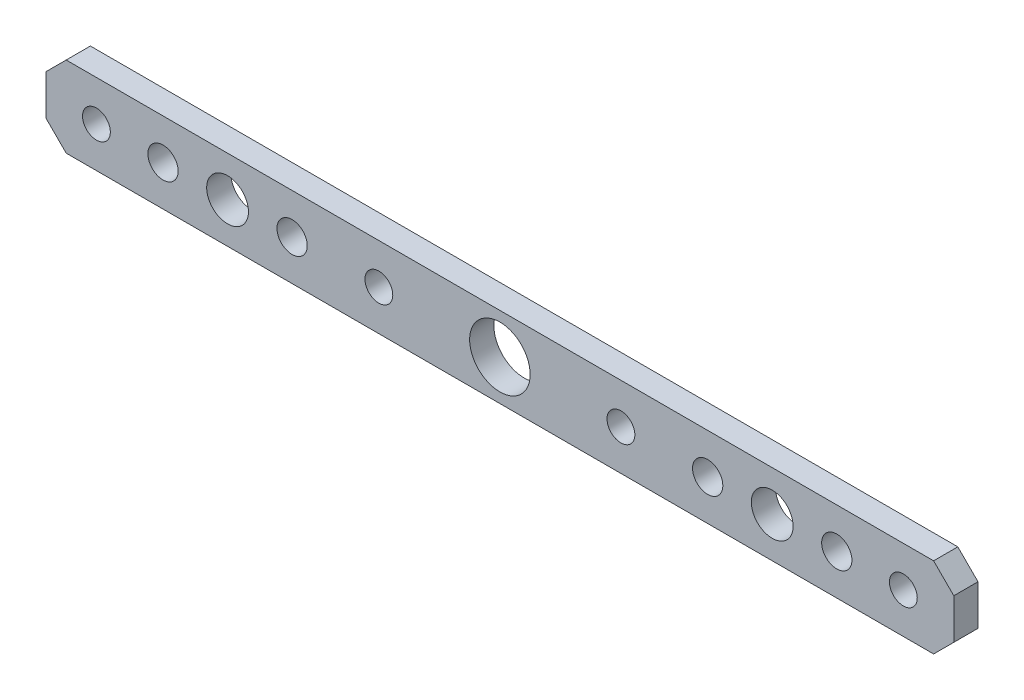
ISO-10303-21;
HEADER;
FILE_DESCRIPTION(('STEP AP214'),'2;1');
FILE_NAME('part.step','',(''),(''),'','','');
FILE_SCHEMA(('AUTOMOTIVE_DESIGN { 1 0 10303 214 1 1 1 1 }'));
ENDSEC;
DATA;
#1=APPLICATION_CONTEXT('core data for automotive mechanical design processes');
#2=APPLICATION_PROTOCOL_DEFINITION('international standard','automotive_design',2000,#1);
#3=PRODUCT_CONTEXT('',#1,'mechanical');
#4=PRODUCT('Part','Part','',(#3));
#5=PRODUCT_RELATED_PRODUCT_CATEGORY('part','',(#4));
#6=PRODUCT_DEFINITION_FORMATION('','',#4);
#7=PRODUCT_DEFINITION_CONTEXT('part definition',#1,'design');
#8=PRODUCT_DEFINITION('design','',#6,#7);
#9=PRODUCT_DEFINITION_SHAPE('','',#8);
#10=(LENGTH_UNIT() NAMED_UNIT(*) SI_UNIT(.MILLI.,.METRE.));
#11=(NAMED_UNIT(*) PLANE_ANGLE_UNIT() SI_UNIT($,.RADIAN.));
#12=(NAMED_UNIT(*) SI_UNIT($,.STERADIAN.) SOLID_ANGLE_UNIT());
#13=UNCERTAINTY_MEASURE_WITH_UNIT(LENGTH_MEASURE(1.E-05),#10,'distance_accuracy_value','');
#14=(GEOMETRIC_REPRESENTATION_CONTEXT(3) GLOBAL_UNCERTAINTY_ASSIGNED_CONTEXT((#13)) GLOBAL_UNIT_ASSIGNED_CONTEXT((#10,
#11,#12)) REPRESENTATION_CONTEXT('',''));
#15=CARTESIAN_POINT('',(0.,0.,0.));
#16=DIRECTION('',(0.,0.,1.));
#17=DIRECTION('',(1.,0.,0.));
#18=AXIS2_PLACEMENT_3D('',#15,#16,#17);
#19=CARTESIAN_POINT('',(0.,0.,6.));
#20=DIRECTION('',(0.,0.,1.));
#21=DIRECTION('',(1.,0.,0.));
#22=AXIS2_PLACEMENT_3D('',#19,#20,#21);
#23=PLANE('',#22);
#24=CARTESIAN_POINT('',(-99.4827668172094,-19.612075112907,6.));
#25=DIRECTION('',(0.,0.,1.));
#26=DIRECTION('',(1.,0.,0.));
#27=AXIS2_PLACEMENT_3D('',#24,#25,#26);
#28=CIRCLE('',#27,3.44580043072532);
#29=CARTESIAN_POINT('',(-96.0369663864841,-19.612075112907,6.));
#30=VERTEX_POINT('',#29);
#31=EDGE_CURVE('E224',#30,#30,#28,.T.);
#32=ORIENTED_EDGE('',*,*,#31,.F.);
#33=EDGE_LOOP('',(#32));
#34=FACE_BOUND('',#33,.T.);
#35=CARTESIAN_POINT('',(-29.4827668172094,-19.612075112907,6.));
#36=DIRECTION('',(0.,0.,1.));
#37=DIRECTION('',(1.,0.,0.));
#38=AXIS2_PLACEMENT_3D('',#35,#36,#37);
#39=CIRCLE('',#38,3.44580043072532);
#40=CARTESIAN_POINT('',(-26.036966386484,-19.612075112907,6.));
#41=VERTEX_POINT('',#40);
#42=EDGE_CURVE('E212',#41,#41,#39,.T.);
#43=ORIENTED_EDGE('',*,*,#42,.F.);
#44=EDGE_LOOP('',(#43));
#45=FACE_BOUND('',#44,.T.);
#46=CARTESIAN_POINT('',(-66.9827668172094,-19.612075112907,6.));
#47=DIRECTION('',(0.,0.,1.));
#48=DIRECTION('',(1.,0.,0.));
#49=AXIS2_PLACEMENT_3D('',#46,#47,#48);
#50=CIRCLE('',#49,5.17499999999999);
#51=CARTESIAN_POINT('',(-61.8077668172094,-19.612075112907,6.));
#52=VERTEX_POINT('',#51);
#53=EDGE_CURVE('E200',#52,#52,#50,.T.);
#54=ORIENTED_EDGE('',*,*,#53,.F.);
#55=EDGE_LOOP('',(#54));
#56=FACE_BOUND('',#55,.T.);
#57=CARTESIAN_POINT('',(-50.9827668172094,-19.612075112907,6.));
#58=DIRECTION('',(0.,0.,1.));
#59=DIRECTION('',(1.,0.,0.));
#60=AXIS2_PLACEMENT_3D('',#57,#58,#59);
#61=CIRCLE('',#60,3.75000000000001);
#62=CARTESIAN_POINT('',(-47.2327668172094,-19.612075112907,6.));
#63=VERTEX_POINT('',#62);
#64=EDGE_CURVE('E188',#63,#63,#61,.T.);
#65=ORIENTED_EDGE('',*,*,#64,.F.);
#66=EDGE_LOOP('',(#65));
#67=FACE_BOUND('',#66,.T.);
#68=CARTESIAN_POINT('',(52.0172331827906,-19.612075112907,6.));
#69=DIRECTION('',(0.,0.,1.));
#70=DIRECTION('',(1.,0.,0.));
#71=AXIS2_PLACEMENT_3D('',#68,#69,#70);
#72=CIRCLE('',#71,3.75000000000001);
#73=CARTESIAN_POINT('',(55.7672331827906,-19.612075112907,6.));
#74=VERTEX_POINT('',#73);
#75=EDGE_CURVE('E177',#74,#74,#72,.T.);
#76=ORIENTED_EDGE('',*,*,#75,.F.);
#77=EDGE_LOOP('',(#76));
#78=FACE_BOUND('',#77,.T.);
#79=DIRECTION('',(1.,0.,0.));
#80=VECTOR('',#79,1.);
#81=CARTESIAN_POINT('',(-111.982766817209,-29.612075112907,6.));
#82=LINE('',#81,#80);
#83=CARTESIAN_POINT('',(-106.982766817209,-29.612075112907,6.));
#84=VERTEX_POINT('',#83);
#85=CARTESIAN_POINT('',(108.017233182791,-29.612075112907,6.));
#86=VERTEX_POINT('',#85);
#87=EDGE_CURVE('E172',#84,#86,#82,.T.);
#88=ORIENTED_EDGE('',*,*,#87,.T.);
#89=DIRECTION('',(-0.707106781186549,-0.707106781186546,0.));
#90=VECTOR('',#89,1.);
#91=CARTESIAN_POINT('',(68.8146541478485,-68.8146541478489,6.));
#92=LINE('',#91,#90);
#93=CARTESIAN_POINT('',(113.017233182791,-24.6120751129071,6.));
#94=VERTEX_POINT('',#93);
#95=EDGE_CURVE('E149',#86,#94,#92,.F.);
#96=ORIENTED_EDGE('',*,*,#95,.T.);
#97=DIRECTION('',(0.,1.,0.));
#98=VECTOR('',#97,1.);
#99=CARTESIAN_POINT('',(113.017233182791,-29.612075112907,6.));
#100=LINE('',#99,#98);
#101=CARTESIAN_POINT('',(113.017233182791,-14.612075112907,6.));
#102=VERTEX_POINT('',#101);
#103=EDGE_CURVE('E119',#94,#102,#100,.T.);
#104=ORIENTED_EDGE('',*,*,#103,.T.);
#105=DIRECTION('',(0.707106781186548,-0.707106781186548,0.));
#106=VECTOR('',#105,1.);
#107=CARTESIAN_POINT('',(49.2025790349418,49.2025790349418,6.));
#108=LINE('',#107,#106);
#109=CARTESIAN_POINT('',(108.017233182791,-9.61207511290702,6.));
#110=VERTEX_POINT('',#109);
#111=EDGE_CURVE('E56',#102,#110,#108,.F.);
#112=ORIENTED_EDGE('',*,*,#111,.T.);
#113=DIRECTION('',(-1.,0.,0.));
#114=VECTOR('',#113,1.);
#115=CARTESIAN_POINT('',(-111.982766817209,-9.61207511290705,6.));
#116=LINE('',#115,#114);
#117=CARTESIAN_POINT('',(-106.982766817209,-9.61207511290705,6.));
#118=VERTEX_POINT('',#117);
#119=EDGE_CURVE('E135',#110,#118,#116,.T.);
#120=ORIENTED_EDGE('',*,*,#119,.T.);
#121=DIRECTION('',(0.707106781186549,0.707106781186546,0.));
#122=VECTOR('',#121,1.);
#123=CARTESIAN_POINT('',(-48.6853458521509,48.6853458521511,6.));
#124=LINE('',#123,#122);
#125=CARTESIAN_POINT('',(-111.982766817209,-14.612075112907,6.));
#126=VERTEX_POINT('',#125);
#127=EDGE_CURVE('E144',#118,#126,#124,.F.);
#128=ORIENTED_EDGE('',*,*,#127,.T.);
#129=DIRECTION('',(0.,-1.,0.));
#130=VECTOR('',#129,1.);
#131=CARTESIAN_POINT('',(-111.982766817209,-9.61207511290705,6.));
#132=LINE('',#131,#130);
#133=CARTESIAN_POINT('',(-111.982766817209,-24.6120751129071,6.));
#134=VERTEX_POINT('',#133);
#135=EDGE_CURVE('E129',#126,#134,#132,.T.);
#136=ORIENTED_EDGE('',*,*,#135,.T.);
#137=DIRECTION('',(-0.707106781186548,0.707106781186548,0.));
#138=VECTOR('',#137,1.);
#139=CARTESIAN_POINT('',(-68.2974209650582,-68.2974209650582,6.));
#140=LINE('',#139,#138);
#141=EDGE_CURVE('E146',#134,#84,#140,.F.);
#142=ORIENTED_EDGE('',*,*,#141,.T.);
#143=EDGE_LOOP('',(#88,#96,#104,#112,#120,#128,#136,#142));
#144=FACE_BOUND('',#143,.T.);
#145=CARTESIAN_POINT('',(84.0172331827906,-19.612075112907,6.));
#146=DIRECTION('',(0.,0.,1.));
#147=DIRECTION('',(1.,0.,0.));
#148=AXIS2_PLACEMENT_3D('',#145,#146,#147);
#149=CIRCLE('',#148,3.75000000000001);
#150=CARTESIAN_POINT('',(87.7672331827906,-19.612075112907,6.));
#151=VERTEX_POINT('',#150);
#152=EDGE_CURVE('E165',#151,#151,#149,.T.);
#153=ORIENTED_EDGE('',*,*,#152,.F.);
#154=EDGE_LOOP('',(#153));
#155=FACE_BOUND('',#154,.T.);
#156=CARTESIAN_POINT('',(68.0172331827906,-19.612075112907,6.));
#157=DIRECTION('',(0.,0.,1.));
#158=DIRECTION('',(1.,0.,0.));
#159=AXIS2_PLACEMENT_3D('',#156,#157,#158);
#160=CIRCLE('',#159,5.17731514716483);
#161=CARTESIAN_POINT('',(73.1945483299555,-19.612075112907,6.));
#162=VERTEX_POINT('',#161);
#163=EDGE_CURVE('E182',#162,#162,#160,.T.);
#164=ORIENTED_EDGE('',*,*,#163,.F.);
#165=EDGE_LOOP('',(#164));
#166=FACE_BOUND('',#165,.T.);
#167=CARTESIAN_POINT('',(-82.9827668172094,-19.612075112907,6.));
#168=DIRECTION('',(0.,0.,1.));
#169=DIRECTION('',(1.,0.,0.));
#170=AXIS2_PLACEMENT_3D('',#167,#168,#169);
#171=CIRCLE('',#170,3.75000000000001);
#172=CARTESIAN_POINT('',(-79.2327668172094,-19.612075112907,6.));
#173=VERTEX_POINT('',#172);
#174=EDGE_CURVE('E194',#173,#173,#171,.T.);
#175=ORIENTED_EDGE('',*,*,#174,.F.);
#176=EDGE_LOOP('',(#175));
#177=FACE_BOUND('',#176,.T.);
#178=CARTESIAN_POINT('',(30.5172331827906,-19.612075112907,6.));
#179=DIRECTION('',(0.,0.,1.));
#180=DIRECTION('',(1.,0.,0.));
#181=AXIS2_PLACEMENT_3D('',#178,#179,#180);
#182=CIRCLE('',#181,3.44580043072533);
#183=CARTESIAN_POINT('',(33.963033613516,-19.612075112907,6.));
#184=VERTEX_POINT('',#183);
#185=EDGE_CURVE('E206',#184,#184,#182,.T.);
#186=ORIENTED_EDGE('',*,*,#185,.F.);
#187=EDGE_LOOP('',(#186));
#188=FACE_BOUND('',#187,.T.);
#189=CARTESIAN_POINT('',(100.517233182791,-19.612075112907,6.));
#190=DIRECTION('',(0.,0.,1.));
#191=DIRECTION('',(1.,0.,0.));
#192=AXIS2_PLACEMENT_3D('',#189,#190,#191);
#193=CIRCLE('',#192,3.44580043072534);
#194=CARTESIAN_POINT('',(103.963033613516,-19.612075112907,6.));
#195=VERTEX_POINT('',#194);
#196=EDGE_CURVE('E218',#195,#195,#193,.T.);
#197=ORIENTED_EDGE('',*,*,#196,.F.);
#198=EDGE_LOOP('',(#197));
#199=FACE_BOUND('',#198,.T.);
#200=CARTESIAN_POINT('',(0.517233182790622,-19.612075112907,6.));
#201=DIRECTION('',(0.,0.,1.));
#202=DIRECTION('',(1.,0.,0.));
#203=AXIS2_PLACEMENT_3D('',#200,#201,#202);
#204=CIRCLE('',#203,7.5);
#205=CARTESIAN_POINT('',(8.01723318279062,-19.612075112907,6.));
#206=VERTEX_POINT('',#205);
#207=EDGE_CURVE('E230',#206,#206,#204,.T.);
#208=ORIENTED_EDGE('',*,*,#207,.F.);
#209=EDGE_LOOP('',(#208));
#210=FACE_BOUND('',#209,.T.);
#211=ADVANCED_FACE('F34',(#34,#45,#56,#67,#78,#144,#155,#166,#177,#188,#199,#210),#23,.T.);
#212=CARTESIAN_POINT('',(0.,0.,0.));
#213=DIRECTION('',(0.,0.,1.));
#214=DIRECTION('',(1.,0.,0.));
#215=AXIS2_PLACEMENT_3D('',#212,#213,#214);
#216=PLANE('',#215);
#217=DIRECTION('',(0.,1.,0.));
#218=VECTOR('',#217,1.);
#219=CARTESIAN_POINT('',(113.017233182791,-29.612075112907,0.));
#220=LINE('',#219,#218);
#221=CARTESIAN_POINT('',(113.017233182791,-24.6120751129071,0.));
#222=VERTEX_POINT('',#221);
#223=CARTESIAN_POINT('',(113.017233182791,-14.612075112907,0.));
#224=VERTEX_POINT('',#223);
#225=EDGE_CURVE('E117',#222,#224,#220,.T.);
#226=ORIENTED_EDGE('',*,*,#225,.F.);
#227=DIRECTION('',(0.707106781186549,0.707106781186546,0.));
#228=VECTOR('',#227,1.);
#229=CARTESIAN_POINT('',(113.017233182791,-24.6120751129071,0.));
#230=LINE('',#229,#228);
#231=CARTESIAN_POINT('',(108.017233182791,-29.612075112907,0.));
#232=VERTEX_POINT('',#231);
#233=EDGE_CURVE('E100',#222,#232,#230,.F.);
#234=ORIENTED_EDGE('',*,*,#233,.T.);
#235=DIRECTION('',(1.,0.,0.));
#236=VECTOR('',#235,1.);
#237=CARTESIAN_POINT('',(-111.982766817209,-29.612075112907,0.));
#238=LINE('',#237,#236);
#239=CARTESIAN_POINT('',(-106.982766817209,-29.612075112907,0.));
#240=VERTEX_POINT('',#239);
#241=EDGE_CURVE('E127',#240,#232,#238,.T.);
#242=ORIENTED_EDGE('',*,*,#241,.F.);
#243=DIRECTION('',(0.707106781186548,-0.707106781186548,0.));
#244=VECTOR('',#243,1.);
#245=CARTESIAN_POINT('',(-106.982766817209,-29.612075112907,0.));
#246=LINE('',#245,#244);
#247=CARTESIAN_POINT('',(-111.982766817209,-24.6120751129071,0.));
#248=VERTEX_POINT('',#247);
#249=EDGE_CURVE('E138',#240,#248,#246,.F.);
#250=ORIENTED_EDGE('',*,*,#249,.T.);
#251=DIRECTION('',(0.,-1.,0.));
#252=VECTOR('',#251,1.);
#253=CARTESIAN_POINT('',(-111.982766817209,-9.61207511290705,0.));
#254=LINE('',#253,#252);
#255=CARTESIAN_POINT('',(-111.982766817209,-14.612075112907,0.));
#256=VERTEX_POINT('',#255);
#257=EDGE_CURVE('E131',#256,#248,#254,.T.);
#258=ORIENTED_EDGE('',*,*,#257,.F.);
#259=DIRECTION('',(-0.707106781186549,-0.707106781186546,0.));
#260=VECTOR('',#259,1.);
#261=CARTESIAN_POINT('',(-111.982766817209,-14.612075112907,0.));
#262=LINE('',#261,#260);
#263=CARTESIAN_POINT('',(-106.982766817209,-9.61207511290705,0.));
#264=VERTEX_POINT('',#263);
#265=EDGE_CURVE('E120',#256,#264,#262,.F.);
#266=ORIENTED_EDGE('',*,*,#265,.T.);
#267=DIRECTION('',(-1.,0.,0.));
#268=VECTOR('',#267,1.);
#269=CARTESIAN_POINT('',(-111.982766817209,-9.61207511290705,0.));
#270=LINE('',#269,#268);
#271=CARTESIAN_POINT('',(108.017233182791,-9.61207511290702,0.));
#272=VERTEX_POINT('',#271);
#273=EDGE_CURVE('E126',#272,#264,#270,.T.);
#274=ORIENTED_EDGE('',*,*,#273,.F.);
#275=DIRECTION('',(-0.707106781186548,0.707106781186548,0.));
#276=VECTOR('',#275,1.);
#277=CARTESIAN_POINT('',(108.017233182791,-9.61207511290702,0.));
#278=LINE('',#277,#276);
#279=EDGE_CURVE('E111',#272,#224,#278,.F.);
#280=ORIENTED_EDGE('',*,*,#279,.T.);
#281=EDGE_LOOP('',(#226,#234,#242,#250,#258,#266,#274,#280));
#282=FACE_BOUND('',#281,.T.);
#283=CARTESIAN_POINT('',(84.0172331827906,-19.612075112907,0.));
#284=DIRECTION('',(0.,0.,1.));
#285=DIRECTION('',(1.,0.,0.));
#286=AXIS2_PLACEMENT_3D('',#283,#284,#285);
#287=CIRCLE('',#286,3.75000000000001);
#288=CARTESIAN_POINT('',(87.7672331827906,-19.612075112907,0.));
#289=VERTEX_POINT('',#288);
#290=EDGE_CURVE('E167',#289,#289,#287,.T.);
#291=ORIENTED_EDGE('',*,*,#290,.T.);
#292=EDGE_LOOP('',(#291));
#293=FACE_BOUND('',#292,.T.);
#294=CARTESIAN_POINT('',(52.0172331827906,-19.612075112907,0.));
#295=DIRECTION('',(0.,0.,1.));
#296=DIRECTION('',(1.,0.,0.));
#297=AXIS2_PLACEMENT_3D('',#294,#295,#296);
#298=CIRCLE('',#297,3.75000000000001);
#299=CARTESIAN_POINT('',(55.7672331827906,-19.612075112907,0.));
#300=VERTEX_POINT('',#299);
#301=EDGE_CURVE('E179',#300,#300,#298,.T.);
#302=ORIENTED_EDGE('',*,*,#301,.T.);
#303=EDGE_LOOP('',(#302));
#304=FACE_BOUND('',#303,.T.);
#305=CARTESIAN_POINT('',(68.0172331827906,-19.612075112907,0.));
#306=DIRECTION('',(0.,0.,1.));
#307=DIRECTION('',(1.,0.,0.));
#308=AXIS2_PLACEMENT_3D('',#305,#306,#307);
#309=CIRCLE('',#308,5.17731514716483);
#310=CARTESIAN_POINT('',(73.1945483299555,-19.612075112907,0.));
#311=VERTEX_POINT('',#310);
#312=EDGE_CURVE('E185',#311,#311,#309,.T.);
#313=ORIENTED_EDGE('',*,*,#312,.T.);
#314=EDGE_LOOP('',(#313));
#315=FACE_BOUND('',#314,.T.);
#316=CARTESIAN_POINT('',(-50.9827668172094,-19.612075112907,0.));
#317=DIRECTION('',(0.,0.,1.));
#318=DIRECTION('',(1.,0.,0.));
#319=AXIS2_PLACEMENT_3D('',#316,#317,#318);
#320=CIRCLE('',#319,3.75000000000001);
#321=CARTESIAN_POINT('',(-47.2327668172094,-19.612075112907,0.));
#322=VERTEX_POINT('',#321);
#323=EDGE_CURVE('E191',#322,#322,#320,.T.);
#324=ORIENTED_EDGE('',*,*,#323,.T.);
#325=EDGE_LOOP('',(#324));
#326=FACE_BOUND('',#325,.T.);
#327=CARTESIAN_POINT('',(-82.9827668172094,-19.612075112907,0.));
#328=DIRECTION('',(0.,0.,1.));
#329=DIRECTION('',(1.,0.,0.));
#330=AXIS2_PLACEMENT_3D('',#327,#328,#329);
#331=CIRCLE('',#330,3.75000000000001);
#332=CARTESIAN_POINT('',(-79.2327668172094,-19.612075112907,0.));
#333=VERTEX_POINT('',#332);
#334=EDGE_CURVE('E197',#333,#333,#331,.T.);
#335=ORIENTED_EDGE('',*,*,#334,.T.);
#336=EDGE_LOOP('',(#335));
#337=FACE_BOUND('',#336,.T.);
#338=CARTESIAN_POINT('',(-66.9827668172094,-19.612075112907,0.));
#339=DIRECTION('',(0.,0.,1.));
#340=DIRECTION('',(1.,0.,0.));
#341=AXIS2_PLACEMENT_3D('',#338,#339,#340);
#342=CIRCLE('',#341,5.17499999999999);
#343=CARTESIAN_POINT('',(-61.8077668172094,-19.612075112907,0.));
#344=VERTEX_POINT('',#343);
#345=EDGE_CURVE('E203',#344,#344,#342,.T.);
#346=ORIENTED_EDGE('',*,*,#345,.T.);
#347=EDGE_LOOP('',(#346));
#348=FACE_BOUND('',#347,.T.);
#349=CARTESIAN_POINT('',(30.5172331827906,-19.612075112907,0.));
#350=DIRECTION('',(0.,0.,1.));
#351=DIRECTION('',(1.,0.,0.));
#352=AXIS2_PLACEMENT_3D('',#349,#350,#351);
#353=CIRCLE('',#352,3.44580043072533);
#354=CARTESIAN_POINT('',(33.963033613516,-19.612075112907,0.));
#355=VERTEX_POINT('',#354);
#356=EDGE_CURVE('E209',#355,#355,#353,.T.);
#357=ORIENTED_EDGE('',*,*,#356,.T.);
#358=EDGE_LOOP('',(#357));
#359=FACE_BOUND('',#358,.T.);
#360=CARTESIAN_POINT('',(-29.4827668172094,-19.612075112907,0.));
#361=DIRECTION('',(0.,0.,1.));
#362=DIRECTION('',(1.,0.,0.));
#363=AXIS2_PLACEMENT_3D('',#360,#361,#362);
#364=CIRCLE('',#363,3.44580043072532);
#365=CARTESIAN_POINT('',(-26.036966386484,-19.612075112907,0.));
#366=VERTEX_POINT('',#365);
#367=EDGE_CURVE('E215',#366,#366,#364,.T.);
#368=ORIENTED_EDGE('',*,*,#367,.T.);
#369=EDGE_LOOP('',(#368));
#370=FACE_BOUND('',#369,.T.);
#371=CARTESIAN_POINT('',(100.517233182791,-19.612075112907,0.));
#372=DIRECTION('',(0.,0.,1.));
#373=DIRECTION('',(1.,0.,0.));
#374=AXIS2_PLACEMENT_3D('',#371,#372,#373);
#375=CIRCLE('',#374,3.44580043072534);
#376=CARTESIAN_POINT('',(103.963033613516,-19.612075112907,0.));
#377=VERTEX_POINT('',#376);
#378=EDGE_CURVE('E221',#377,#377,#375,.T.);
#379=ORIENTED_EDGE('',*,*,#378,.T.);
#380=EDGE_LOOP('',(#379));
#381=FACE_BOUND('',#380,.T.);
#382=CARTESIAN_POINT('',(-99.4827668172094,-19.612075112907,0.));
#383=DIRECTION('',(0.,0.,1.));
#384=DIRECTION('',(1.,0.,0.));
#385=AXIS2_PLACEMENT_3D('',#382,#383,#384);
#386=CIRCLE('',#385,3.44580043072532);
#387=CARTESIAN_POINT('',(-96.0369663864841,-19.612075112907,0.));
#388=VERTEX_POINT('',#387);
#389=EDGE_CURVE('E227',#388,#388,#386,.T.);
#390=ORIENTED_EDGE('',*,*,#389,.T.);
#391=EDGE_LOOP('',(#390));
#392=FACE_BOUND('',#391,.T.);
#393=CARTESIAN_POINT('',(0.517233182790622,-19.612075112907,0.));
#394=DIRECTION('',(0.,0.,1.));
#395=DIRECTION('',(1.,0.,0.));
#396=AXIS2_PLACEMENT_3D('',#393,#394,#395);
#397=CIRCLE('',#396,7.5);
#398=CARTESIAN_POINT('',(8.01723318279062,-19.612075112907,0.));
#399=VERTEX_POINT('',#398);
#400=EDGE_CURVE('E233',#399,#399,#397,.T.);
#401=ORIENTED_EDGE('',*,*,#400,.T.);
#402=EDGE_LOOP('',(#401));
#403=FACE_BOUND('',#402,.T.);
#404=ADVANCED_FACE('F123',(#282,#293,#304,#315,#326,#337,#348,#359,#370,#381,#392,#403),#216,.F.);
#405=CARTESIAN_POINT('',(-111.982766817209,-9.61207511290705,6.));
#406=DIRECTION('',(1.,0.,0.));
#407=DIRECTION('',(0.,0.,-1.));
#408=AXIS2_PLACEMENT_3D('',#405,#406,#407);
#409=PLANE('',#408);
#410=ORIENTED_EDGE('',*,*,#257,.T.);
#411=DIRECTION('',(0.,0.,1.));
#412=VECTOR('',#411,1.);
#413=CARTESIAN_POINT('',(-111.982766817209,-24.6120751129071,6.));
#414=LINE('',#413,#412);
#415=EDGE_CURVE('E11',#248,#134,#414,.T.);
#416=ORIENTED_EDGE('',*,*,#415,.T.);
#417=ORIENTED_EDGE('',*,*,#135,.F.);
#418=DIRECTION('',(0.,0.,-1.));
#419=VECTOR('',#418,1.);
#420=CARTESIAN_POINT('',(-111.982766817209,-14.612075112907,6.));
#421=LINE('',#420,#419);
#422=EDGE_CURVE('E42',#126,#256,#421,.T.);
#423=ORIENTED_EDGE('',*,*,#422,.T.);
#424=EDGE_LOOP('',(#410,#416,#417,#423));
#425=FACE_BOUND('',#424,.T.);
#426=ADVANCED_FACE('F160',(#425),#409,.F.);
#427=CARTESIAN_POINT('',(-111.982766817209,-29.612075112907,6.));
#428=DIRECTION('',(0.,1.,0.));
#429=DIRECTION('',(0.,0.,1.));
#430=AXIS2_PLACEMENT_3D('',#427,#428,#429);
#431=PLANE('',#430);
#432=ORIENTED_EDGE('',*,*,#241,.T.);
#433=DIRECTION('',(0.,0.,1.));
#434=VECTOR('',#433,1.);
#435=CARTESIAN_POINT('',(108.017233182791,-29.612075112907,6.));
#436=LINE('',#435,#434);
#437=EDGE_CURVE('E105',#232,#86,#436,.T.);
#438=ORIENTED_EDGE('',*,*,#437,.T.);
#439=ORIENTED_EDGE('',*,*,#87,.F.);
#440=DIRECTION('',(0.,0.,-1.));
#441=VECTOR('',#440,1.);
#442=CARTESIAN_POINT('',(-106.982766817209,-29.612075112907,6.));
#443=LINE('',#442,#441);
#444=EDGE_CURVE('E110',#84,#240,#443,.T.);
#445=ORIENTED_EDGE('',*,*,#444,.T.);
#446=EDGE_LOOP('',(#432,#438,#439,#445));
#447=FACE_BOUND('',#446,.T.);
#448=ADVANCED_FACE('F260',(#447),#431,.F.);
#449=CARTESIAN_POINT('',(113.017233182791,-29.612075112907,6.));
#450=DIRECTION('',(-1.,0.,0.));
#451=DIRECTION('',(0.,0.,1.));
#452=AXIS2_PLACEMENT_3D('',#449,#450,#451);
#453=PLANE('',#452);
#454=ORIENTED_EDGE('',*,*,#103,.F.);
#455=DIRECTION('',(0.,0.,-1.));
#456=VECTOR('',#455,1.);
#457=CARTESIAN_POINT('',(113.017233182791,-24.6120751129071,6.));
#458=LINE('',#457,#456);
#459=EDGE_CURVE('E104',#94,#222,#458,.T.);
#460=ORIENTED_EDGE('',*,*,#459,.T.);
#461=ORIENTED_EDGE('',*,*,#225,.T.);
#462=DIRECTION('',(0.,0.,1.));
#463=VECTOR('',#462,1.);
#464=CARTESIAN_POINT('',(113.017233182791,-14.612075112907,6.));
#465=LINE('',#464,#463);
#466=EDGE_CURVE('E121',#224,#102,#465,.T.);
#467=ORIENTED_EDGE('',*,*,#466,.T.);
#468=EDGE_LOOP('',(#454,#460,#461,#467));
#469=FACE_BOUND('',#468,.T.);
#470=ADVANCED_FACE('F116',(#469),#453,.F.);
#471=CARTESIAN_POINT('',(-111.982766817209,-9.61207511290705,6.));
#472=DIRECTION('',(0.,-1.,0.));
#473=DIRECTION('',(1.,0.,0.));
#474=AXIS2_PLACEMENT_3D('',#471,#472,#473);
#475=PLANE('',#474);
#476=ORIENTED_EDGE('',*,*,#119,.F.);
#477=DIRECTION('',(0.,0.,-1.));
#478=VECTOR('',#477,1.);
#479=CARTESIAN_POINT('',(108.017233182791,-9.61207511290702,6.));
#480=LINE('',#479,#478);
#481=EDGE_CURVE('E152',#110,#272,#480,.T.);
#482=ORIENTED_EDGE('',*,*,#481,.T.);
#483=ORIENTED_EDGE('',*,*,#273,.T.);
#484=DIRECTION('',(0.,0.,1.));
#485=VECTOR('',#484,1.);
#486=CARTESIAN_POINT('',(-106.982766817209,-9.61207511290705,6.));
#487=LINE('',#486,#485);
#488=EDGE_CURVE('E49',#264,#118,#487,.T.);
#489=ORIENTED_EDGE('',*,*,#488,.T.);
#490=EDGE_LOOP('',(#476,#482,#483,#489));
#491=FACE_BOUND('',#490,.T.);
#492=ADVANCED_FACE('F255',(#491),#475,.F.);
#493=CARTESIAN_POINT('',(84.0172331827906,-19.612075112907,6.));
#494=DIRECTION('',(0.,0.,-1.));
#495=DIRECTION('',(-1.,0.,0.));
#496=AXIS2_PLACEMENT_3D('',#493,#494,#495);
#497=CYLINDRICAL_SURFACE('',#496,3.75000000000001);
#498=ORIENTED_EDGE('',*,*,#152,.T.);
#499=EDGE_LOOP('',(#498));
#500=FACE_BOUND('',#499,.T.);
#501=ORIENTED_EDGE('',*,*,#290,.F.);
#502=EDGE_LOOP('',(#501));
#503=FACE_BOUND('',#502,.T.);
#504=ADVANCED_FACE('F252',(#500,#503),#497,.F.);
#505=CARTESIAN_POINT('',(52.0172331827906,-19.612075112907,6.));
#506=DIRECTION('',(0.,0.,-1.));
#507=DIRECTION('',(-1.,0.,0.));
#508=AXIS2_PLACEMENT_3D('',#505,#506,#507);
#509=CYLINDRICAL_SURFACE('',#508,3.75000000000001);
#510=ORIENTED_EDGE('',*,*,#75,.T.);
#511=EDGE_LOOP('',(#510));
#512=FACE_BOUND('',#511,.T.);
#513=ORIENTED_EDGE('',*,*,#301,.F.);
#514=EDGE_LOOP('',(#513));
#515=FACE_BOUND('',#514,.T.);
#516=ADVANCED_FACE('F333',(#512,#515),#509,.F.);
#517=CARTESIAN_POINT('',(68.0172331827906,-19.612075112907,6.));
#518=DIRECTION('',(0.,0.,-1.));
#519=DIRECTION('',(-1.,0.,0.));
#520=AXIS2_PLACEMENT_3D('',#517,#518,#519);
#521=CYLINDRICAL_SURFACE('',#520,5.17731514716483);
#522=ORIENTED_EDGE('',*,*,#163,.T.);
#523=EDGE_LOOP('',(#522));
#524=FACE_BOUND('',#523,.T.);
#525=ORIENTED_EDGE('',*,*,#312,.F.);
#526=EDGE_LOOP('',(#525));
#527=FACE_BOUND('',#526,.T.);
#528=ADVANCED_FACE('F330',(#524,#527),#521,.F.);
#529=CARTESIAN_POINT('',(-50.9827668172094,-19.612075112907,6.));
#530=DIRECTION('',(0.,0.,-1.));
#531=DIRECTION('',(-1.,0.,0.));
#532=AXIS2_PLACEMENT_3D('',#529,#530,#531);
#533=CYLINDRICAL_SURFACE('',#532,3.75000000000001);
#534=ORIENTED_EDGE('',*,*,#64,.T.);
#535=EDGE_LOOP('',(#534));
#536=FACE_BOUND('',#535,.T.);
#537=ORIENTED_EDGE('',*,*,#323,.F.);
#538=EDGE_LOOP('',(#537));
#539=FACE_BOUND('',#538,.T.);
#540=ADVANCED_FACE('F326',(#536,#539),#533,.F.);
#541=CARTESIAN_POINT('',(-82.9827668172094,-19.612075112907,6.));
#542=DIRECTION('',(0.,0.,-1.));
#543=DIRECTION('',(-1.,0.,0.));
#544=AXIS2_PLACEMENT_3D('',#541,#542,#543);
#545=CYLINDRICAL_SURFACE('',#544,3.75000000000001);
#546=ORIENTED_EDGE('',*,*,#174,.T.);
#547=EDGE_LOOP('',(#546));
#548=FACE_BOUND('',#547,.T.);
#549=ORIENTED_EDGE('',*,*,#334,.F.);
#550=EDGE_LOOP('',(#549));
#551=FACE_BOUND('',#550,.T.);
#552=ADVANCED_FACE('F322',(#548,#551),#545,.F.);
#553=CARTESIAN_POINT('',(-66.9827668172094,-19.612075112907,6.));
#554=DIRECTION('',(0.,0.,-1.));
#555=DIRECTION('',(-1.,0.,0.));
#556=AXIS2_PLACEMENT_3D('',#553,#554,#555);
#557=CYLINDRICAL_SURFACE('',#556,5.17499999999999);
#558=ORIENTED_EDGE('',*,*,#53,.T.);
#559=EDGE_LOOP('',(#558));
#560=FACE_BOUND('',#559,.T.);
#561=ORIENTED_EDGE('',*,*,#345,.F.);
#562=EDGE_LOOP('',(#561));
#563=FACE_BOUND('',#562,.T.);
#564=ADVANCED_FACE('F318',(#560,#563),#557,.F.);
#565=CARTESIAN_POINT('',(30.5172331827906,-19.612075112907,6.));
#566=DIRECTION('',(0.,0.,-1.));
#567=DIRECTION('',(-1.,0.,0.));
#568=AXIS2_PLACEMENT_3D('',#565,#566,#567);
#569=CYLINDRICAL_SURFACE('',#568,3.44580043072533);
#570=ORIENTED_EDGE('',*,*,#185,.T.);
#571=EDGE_LOOP('',(#570));
#572=FACE_BOUND('',#571,.T.);
#573=ORIENTED_EDGE('',*,*,#356,.F.);
#574=EDGE_LOOP('',(#573));
#575=FACE_BOUND('',#574,.T.);
#576=ADVANCED_FACE('F314',(#572,#575),#569,.F.);
#577=CARTESIAN_POINT('',(-29.4827668172094,-19.612075112907,6.));
#578=DIRECTION('',(0.,0.,-1.));
#579=DIRECTION('',(-1.,0.,0.));
#580=AXIS2_PLACEMENT_3D('',#577,#578,#579);
#581=CYLINDRICAL_SURFACE('',#580,3.44580043072532);
#582=ORIENTED_EDGE('',*,*,#42,.T.);
#583=EDGE_LOOP('',(#582));
#584=FACE_BOUND('',#583,.T.);
#585=ORIENTED_EDGE('',*,*,#367,.F.);
#586=EDGE_LOOP('',(#585));
#587=FACE_BOUND('',#586,.T.);
#588=ADVANCED_FACE('F296',(#584,#587),#581,.F.);
#589=CARTESIAN_POINT('',(100.517233182791,-19.612075112907,6.));
#590=DIRECTION('',(0.,0.,-1.));
#591=DIRECTION('',(-1.,0.,0.));
#592=AXIS2_PLACEMENT_3D('',#589,#590,#591);
#593=CYLINDRICAL_SURFACE('',#592,3.44580043072534);
#594=ORIENTED_EDGE('',*,*,#196,.T.);
#595=EDGE_LOOP('',(#594));
#596=FACE_BOUND('',#595,.T.);
#597=ORIENTED_EDGE('',*,*,#378,.F.);
#598=EDGE_LOOP('',(#597));
#599=FACE_BOUND('',#598,.T.);
#600=ADVANCED_FACE('F292',(#596,#599),#593,.F.);
#601=CARTESIAN_POINT('',(-99.4827668172094,-19.612075112907,6.));
#602=DIRECTION('',(0.,0.,-1.));
#603=DIRECTION('',(-1.,0.,0.));
#604=AXIS2_PLACEMENT_3D('',#601,#602,#603);
#605=CYLINDRICAL_SURFACE('',#604,3.44580043072532);
#606=ORIENTED_EDGE('',*,*,#31,.T.);
#607=EDGE_LOOP('',(#606));
#608=FACE_BOUND('',#607,.T.);
#609=ORIENTED_EDGE('',*,*,#389,.F.);
#610=EDGE_LOOP('',(#609));
#611=FACE_BOUND('',#610,.T.);
#612=ADVANCED_FACE('F295',(#608,#611),#605,.F.);
#613=CARTESIAN_POINT('',(0.517233182790622,-19.612075112907,6.));
#614=DIRECTION('',(0.,0.,-1.));
#615=DIRECTION('',(-1.,0.,0.));
#616=AXIS2_PLACEMENT_3D('',#613,#614,#615);
#617=CYLINDRICAL_SURFACE('',#616,7.5);
#618=ORIENTED_EDGE('',*,*,#207,.T.);
#619=EDGE_LOOP('',(#618));
#620=FACE_BOUND('',#619,.T.);
#621=ORIENTED_EDGE('',*,*,#400,.F.);
#622=EDGE_LOOP('',(#621));
#623=FACE_BOUND('',#622,.T.);
#624=ADVANCED_FACE('F239',(#620,#623),#617,.F.);
#625=CARTESIAN_POINT('',(113.017233182791,-24.6120751129071,6.));
#626=DIRECTION('',(-0.707106781186546,0.707106781186549,0.));
#627=DIRECTION('',(0.,0.,-1.));
#628=AXIS2_PLACEMENT_3D('',#625,#626,#627);
#629=PLANE('',#628);
#630=ORIENTED_EDGE('',*,*,#95,.F.);
#631=ORIENTED_EDGE('',*,*,#437,.F.);
#632=ORIENTED_EDGE('',*,*,#233,.F.);
#633=ORIENTED_EDGE('',*,*,#459,.F.);
#634=EDGE_LOOP('',(#630,#631,#632,#633));
#635=FACE_BOUND('',#634,.T.);
#636=ADVANCED_FACE('F103',(#635),#629,.F.);
#637=CARTESIAN_POINT('',(108.017233182791,-9.61207511290702,6.));
#638=DIRECTION('',(-0.707106781186547,-0.707106781186547,0.));
#639=DIRECTION('',(0.,0.,-1.));
#640=AXIS2_PLACEMENT_3D('',#637,#638,#639);
#641=PLANE('',#640);
#642=ORIENTED_EDGE('',*,*,#111,.F.);
#643=ORIENTED_EDGE('',*,*,#466,.F.);
#644=ORIENTED_EDGE('',*,*,#279,.F.);
#645=ORIENTED_EDGE('',*,*,#481,.F.);
#646=EDGE_LOOP('',(#642,#643,#644,#645));
#647=FACE_BOUND('',#646,.T.);
#648=ADVANCED_FACE('F268',(#647),#641,.F.);
#649=CARTESIAN_POINT('',(-106.982766817209,-29.612075112907,6.));
#650=DIRECTION('',(0.707106781186548,0.707106781186548,0.));
#651=DIRECTION('',(0.,0.,-1.));
#652=AXIS2_PLACEMENT_3D('',#649,#650,#651);
#653=PLANE('',#652);
#654=ORIENTED_EDGE('',*,*,#141,.F.);
#655=ORIENTED_EDGE('',*,*,#415,.F.);
#656=ORIENTED_EDGE('',*,*,#249,.F.);
#657=ORIENTED_EDGE('',*,*,#444,.F.);
#658=EDGE_LOOP('',(#654,#655,#656,#657));
#659=FACE_BOUND('',#658,.T.);
#660=ADVANCED_FACE('F270',(#659),#653,.F.);
#661=CARTESIAN_POINT('',(-111.982766817209,-14.612075112907,6.));
#662=DIRECTION('',(0.707106781186546,-0.707106781186549,0.));
#663=DIRECTION('',(0.,0.,-1.));
#664=AXIS2_PLACEMENT_3D('',#661,#662,#663);
#665=PLANE('',#664);
#666=ORIENTED_EDGE('',*,*,#127,.F.);
#667=ORIENTED_EDGE('',*,*,#488,.F.);
#668=ORIENTED_EDGE('',*,*,#265,.F.);
#669=ORIENTED_EDGE('',*,*,#422,.F.);
#670=EDGE_LOOP('',(#666,#667,#668,#669));
#671=FACE_BOUND('',#670,.T.);
#672=ADVANCED_FACE('F36',(#671),#665,.F.);
#673=CLOSED_SHELL('',(#211,#404,#426,#448,#470,#492,#504,#516,#528,#540,#552,#564,#576,#588,
#600,#612,#624,#636,#648,#660,#672));
#674=MANIFOLD_SOLID_BREP('B2',#673);
#675=ADVANCED_BREP_SHAPE_REPRESENTATION('',(#18,#674),#14);
#676=SHAPE_DEFINITION_REPRESENTATION(#9,#675);
ENDSEC;
END-ISO-10303-21;
